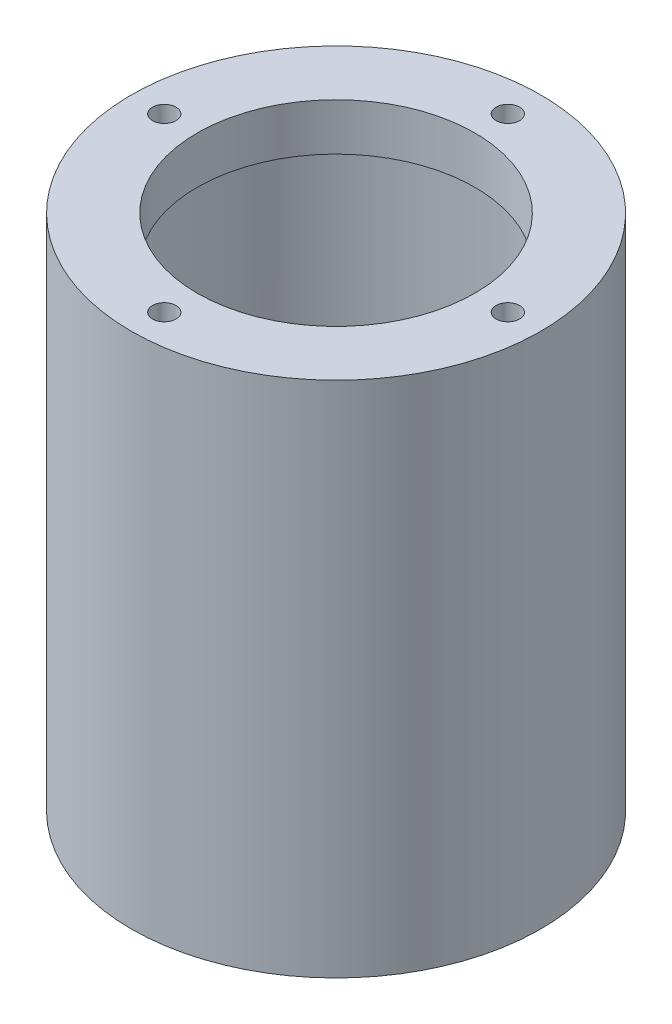
ISO-10303-21;
HEADER;
FILE_DESCRIPTION(('STEP AP214'),'2;1');
FILE_NAME('part.step','',(''),(''),'','','');
FILE_SCHEMA(('AUTOMOTIVE_DESIGN { 1 0 10303 214 1 1 1 1 }'));
ENDSEC;
DATA;
#1=APPLICATION_CONTEXT('core data for automotive mechanical design processes');
#2=APPLICATION_PROTOCOL_DEFINITION('international standard','automotive_design',2000,#1);
#3=PRODUCT_CONTEXT('',#1,'mechanical');
#4=PRODUCT('Part','Part','',(#3));
#5=PRODUCT_RELATED_PRODUCT_CATEGORY('part','',(#4));
#6=PRODUCT_DEFINITION_FORMATION('','',#4);
#7=PRODUCT_DEFINITION_CONTEXT('part definition',#1,'design');
#8=PRODUCT_DEFINITION('design','',#6,#7);
#9=PRODUCT_DEFINITION_SHAPE('','',#8);
#10=(LENGTH_UNIT() NAMED_UNIT(*) SI_UNIT(.MILLI.,.METRE.));
#11=(NAMED_UNIT(*) PLANE_ANGLE_UNIT() SI_UNIT($,.RADIAN.));
#12=(NAMED_UNIT(*) SI_UNIT($,.STERADIAN.) SOLID_ANGLE_UNIT());
#13=UNCERTAINTY_MEASURE_WITH_UNIT(LENGTH_MEASURE(1.E-05),#10,'distance_accuracy_value','');
#14=(GEOMETRIC_REPRESENTATION_CONTEXT(3) GLOBAL_UNCERTAINTY_ASSIGNED_CONTEXT((#13)) GLOBAL_UNIT_ASSIGNED_CONTEXT((#10,
#11,#12)) REPRESENTATION_CONTEXT('',''));
#15=CARTESIAN_POINT('',(0.,0.,0.));
#16=DIRECTION('',(0.,0.,1.));
#17=DIRECTION('',(1.,0.,0.));
#18=AXIS2_PLACEMENT_3D('',#15,#16,#17);
#19=CARTESIAN_POINT('',(0.,55.,0.));
#20=DIRECTION('',(0.,1.,0.));
#21=DIRECTION('',(0.,0.,1.));
#22=AXIS2_PLACEMENT_3D('',#19,#20,#21);
#23=PLANE('',#22);
#24=CARTESIAN_POINT('',(-18.25,55.,0.));
#25=DIRECTION('',(0.,1.,0.));
#26=DIRECTION('',(0.,0.,1.));
#27=AXIS2_PLACEMENT_3D('',#24,#25,#26);
#28=CIRCLE('',#27,1.25);
#29=CARTESIAN_POINT('',(-18.25,55.,1.25));
#30=VERTEX_POINT('',#29);
#31=EDGE_CURVE('E82',#30,#30,#28,.T.);
#32=ORIENTED_EDGE('',*,*,#31,.F.);
#33=EDGE_LOOP('',(#32));
#34=FACE_BOUND('',#33,.T.);
#35=CARTESIAN_POINT('',(0.,55.,18.25));
#36=DIRECTION('',(0.,1.,0.));
#37=DIRECTION('',(0.,0.,1.));
#38=AXIS2_PLACEMENT_3D('',#35,#36,#37);
#39=CIRCLE('',#38,1.25);
#40=CARTESIAN_POINT('',(0.,55.,19.5));
#41=VERTEX_POINT('',#40);
#42=EDGE_CURVE('E81',#41,#41,#39,.T.);
#43=ORIENTED_EDGE('',*,*,#42,.F.);
#44=EDGE_LOOP('',(#43));
#45=FACE_BOUND('',#44,.T.);
#46=CARTESIAN_POINT('',(18.25,55.,0.));
#47=DIRECTION('',(0.,1.,0.));
#48=DIRECTION('',(0.,0.,1.));
#49=AXIS2_PLACEMENT_3D('',#46,#47,#48);
#50=CIRCLE('',#49,1.25);
#51=CARTESIAN_POINT('',(18.25,55.,1.25));
#52=VERTEX_POINT('',#51);
#53=EDGE_CURVE('E267',#52,#52,#50,.T.);
#54=ORIENTED_EDGE('',*,*,#53,.F.);
#55=EDGE_LOOP('',(#54));
#56=FACE_BOUND('',#55,.T.);
#57=CARTESIAN_POINT('',(0.,55.,-18.25));
#58=DIRECTION('',(0.,1.,0.));
#59=DIRECTION('',(0.,0.,1.));
#60=AXIS2_PLACEMENT_3D('',#57,#58,#59);
#61=CIRCLE('',#60,1.25);
#62=CARTESIAN_POINT('',(0.,55.,-17.));
#63=VERTEX_POINT('',#62);
#64=EDGE_CURVE('E112',#63,#63,#61,.T.);
#65=ORIENTED_EDGE('',*,*,#64,.F.);
#66=EDGE_LOOP('',(#65));
#67=FACE_BOUND('',#66,.T.);
#68=CARTESIAN_POINT('',(0.,55.,0.));
#69=DIRECTION('',(0.,1.,0.));
#70=DIRECTION('',(0.,0.,1.));
#71=AXIS2_PLACEMENT_3D('',#68,#69,#70);
#72=CIRCLE('',#71,21.75);
#73=CARTESIAN_POINT('',(0.,55.,21.75));
#74=VERTEX_POINT('',#73);
#75=EDGE_CURVE('E129',#74,#74,#72,.T.);
#76=ORIENTED_EDGE('',*,*,#75,.T.);
#77=EDGE_LOOP('',(#76));
#78=FACE_BOUND('',#77,.T.);
#79=CARTESIAN_POINT('',(0.,55.,0.));
#80=DIRECTION('',(0.,1.,0.));
#81=DIRECTION('',(0.,0.,1.));
#82=AXIS2_PLACEMENT_3D('',#79,#80,#81);
#83=CIRCLE('',#82,14.75);
#84=CARTESIAN_POINT('',(0.,55.,14.75));
#85=VERTEX_POINT('',#84);
#86=EDGE_CURVE('E117',#85,#85,#83,.T.);
#87=ORIENTED_EDGE('',*,*,#86,.F.);
#88=EDGE_LOOP('',(#87));
#89=FACE_BOUND('',#88,.T.);
#90=ADVANCED_FACE('F33',(#34,#45,#56,#67,#78,#89),#23,.T.);
#91=CARTESIAN_POINT('',(0.,0.,0.));
#92=DIRECTION('',(0.,1.,0.));
#93=DIRECTION('',(0.,0.,1.));
#94=AXIS2_PLACEMENT_3D('',#91,#92,#93);
#95=PLANE('',#94);
#96=CARTESIAN_POINT('',(0.,0.,0.));
#97=DIRECTION('',(0.,1.,0.));
#98=DIRECTION('',(0.,0.,1.));
#99=AXIS2_PLACEMENT_3D('',#96,#97,#98);
#100=CIRCLE('',#99,18.75);
#101=CARTESIAN_POINT('',(0.,0.,18.75));
#102=VERTEX_POINT('',#101);
#103=EDGE_CURVE('E115',#102,#102,#100,.T.);
#104=ORIENTED_EDGE('',*,*,#103,.T.);
#105=EDGE_LOOP('',(#104));
#106=FACE_BOUND('',#105,.T.);
#107=CARTESIAN_POINT('',(0.,0.,0.));
#108=DIRECTION('',(0.,1.,0.));
#109=DIRECTION('',(0.,0.,1.));
#110=AXIS2_PLACEMENT_3D('',#107,#108,#109);
#111=CIRCLE('',#110,21.75);
#112=CARTESIAN_POINT('',(0.,0.,21.75));
#113=VERTEX_POINT('',#112);
#114=EDGE_CURVE('E121',#113,#113,#111,.T.);
#115=ORIENTED_EDGE('',*,*,#114,.F.);
#116=EDGE_LOOP('',(#115));
#117=FACE_BOUND('',#116,.T.);
#118=ADVANCED_FACE('F138',(#106,#117),#95,.F.);
#119=CARTESIAN_POINT('',(0.,55.,0.));
#120=DIRECTION('',(0.,-1.,0.));
#121=DIRECTION('',(0.,0.,-1.));
#122=AXIS2_PLACEMENT_3D('',#119,#120,#121);
#123=CYLINDRICAL_SURFACE('',#122,21.75);
#124=ORIENTED_EDGE('',*,*,#75,.F.);
#125=EDGE_LOOP('',(#124));
#126=FACE_BOUND('',#125,.T.);
#127=ORIENTED_EDGE('',*,*,#114,.T.);
#128=EDGE_LOOP('',(#127));
#129=FACE_BOUND('',#128,.T.);
#130=ADVANCED_FACE('F35',(#126,#129),#123,.T.);
#131=CARTESIAN_POINT('',(0.,55.,0.));
#132=DIRECTION('',(0.,-1.,0.));
#133=DIRECTION('',(0.,0.,-1.));
#134=AXIS2_PLACEMENT_3D('',#131,#132,#133);
#135=CYLINDRICAL_SURFACE('',#134,14.75);
#136=CARTESIAN_POINT('',(0.,50.,0.));
#137=DIRECTION('',(0.,1.,0.));
#138=DIRECTION('',(0.,0.,1.));
#139=AXIS2_PLACEMENT_3D('',#136,#137,#138);
#140=CIRCLE('',#139,14.75);
#141=CARTESIAN_POINT('',(0.,50.,14.75));
#142=VERTEX_POINT('',#141);
#143=EDGE_CURVE('E103',#142,#142,#140,.T.);
#144=ORIENTED_EDGE('',*,*,#143,.F.);
#145=EDGE_LOOP('',(#144));
#146=FACE_BOUND('',#145,.T.);
#147=ORIENTED_EDGE('',*,*,#86,.T.);
#148=EDGE_LOOP('',(#147));
#149=FACE_BOUND('',#148,.T.);
#150=ADVANCED_FACE('F144',(#146,#149),#135,.F.);
#151=CARTESIAN_POINT('',(0.,0.,0.));
#152=DIRECTION('',(0.,1.,0.));
#153=DIRECTION('',(0.,0.,1.));
#154=AXIS2_PLACEMENT_3D('',#151,#152,#153);
#155=CYLINDRICAL_SURFACE('',#154,18.75);
#156=ORIENTED_EDGE('',*,*,#103,.F.);
#157=EDGE_LOOP('',(#156));
#158=FACE_BOUND('',#157,.T.);
#159=CARTESIAN_POINT('',(0.,50.,0.));
#160=DIRECTION('',(0.,1.,0.));
#161=DIRECTION('',(0.,0.,1.));
#162=AXIS2_PLACEMENT_3D('',#159,#160,#161);
#163=CIRCLE('',#162,18.75);
#164=CARTESIAN_POINT('',(1.16067474398506,50.,-18.7140410958904));
#165=VERTEX_POINT('',#164);
#166=CARTESIAN_POINT('',(-1.16067474398508,50.,-18.7140410958904));
#167=VERTEX_POINT('',#166);
#168=EDGE_CURVE('E91',#165,#167,#163,.T.);
#169=ORIENTED_EDGE('',*,*,#168,.T.);
#170=CARTESIAN_POINT('',(-18.7140410958904,50.,-1.16067474398506));
#171=VERTEX_POINT('',#170);
#172=EDGE_CURVE('E94',#167,#171,#163,.T.);
#173=ORIENTED_EDGE('',*,*,#172,.T.);
#174=CARTESIAN_POINT('',(-18.7140410958904,50.,1.16067474398508));
#175=VERTEX_POINT('',#174);
#176=EDGE_CURVE('E80',#171,#175,#163,.T.);
#177=ORIENTED_EDGE('',*,*,#176,.T.);
#178=CARTESIAN_POINT('',(-1.16067474398506,50.,18.7140410958904));
#179=VERTEX_POINT('',#178);
#180=EDGE_CURVE('E55',#175,#179,#163,.T.);
#181=ORIENTED_EDGE('',*,*,#180,.T.);
#182=CARTESIAN_POINT('',(1.16067474398508,50.,18.7140410958904));
#183=VERTEX_POINT('',#182);
#184=EDGE_CURVE('E89',#179,#183,#163,.T.);
#185=ORIENTED_EDGE('',*,*,#184,.T.);
#186=CARTESIAN_POINT('',(18.7140410958904,50.,1.16067474398506));
#187=VERTEX_POINT('',#186);
#188=EDGE_CURVE('E95',#183,#187,#163,.T.);
#189=ORIENTED_EDGE('',*,*,#188,.T.);
#190=CARTESIAN_POINT('',(18.7140410958904,50.,-1.16067474398508));
#191=VERTEX_POINT('',#190);
#192=EDGE_CURVE('E96',#187,#191,#163,.T.);
#193=ORIENTED_EDGE('',*,*,#192,.T.);
#194=EDGE_CURVE('E101',#191,#165,#163,.T.);
#195=ORIENTED_EDGE('',*,*,#194,.T.);
#196=EDGE_LOOP('',(#169,#173,#177,#181,#185,#189,#193,#195));
#197=FACE_BOUND('',#196,.T.);
#198=ADVANCED_FACE('F93',(#158,#197),#155,.F.);
#199=CARTESIAN_POINT('',(0.,50.,0.));
#200=DIRECTION('',(0.,1.,0.));
#201=DIRECTION('',(0.,0.,1.));
#202=AXIS2_PLACEMENT_3D('',#199,#200,#201);
#203=PLANE('',#202);
#204=ORIENTED_EDGE('',*,*,#143,.T.);
#205=EDGE_LOOP('',(#204));
#206=FACE_BOUND('',#205,.T.);
#207=ORIENTED_EDGE('',*,*,#180,.F.);
#208=CARTESIAN_POINT('',(-18.25,50.,0.));
#209=DIRECTION('',(0.,1.,0.));
#210=DIRECTION('',(0.,0.,1.));
#211=AXIS2_PLACEMENT_3D('',#208,#209,#210);
#212=CIRCLE('',#211,1.25);
#213=EDGE_CURVE('E11',#175,#171,#212,.T.);
#214=ORIENTED_EDGE('',*,*,#213,.T.);
#215=ORIENTED_EDGE('',*,*,#172,.F.);
#216=CARTESIAN_POINT('',(0.,50.,-18.25));
#217=DIRECTION('',(0.,1.,0.));
#218=DIRECTION('',(0.,0.,1.));
#219=AXIS2_PLACEMENT_3D('',#216,#217,#218);
#220=CIRCLE('',#219,1.25);
#221=EDGE_CURVE('E126',#167,#165,#220,.T.);
#222=ORIENTED_EDGE('',*,*,#221,.T.);
#223=ORIENTED_EDGE('',*,*,#194,.F.);
#224=CARTESIAN_POINT('',(18.25,50.,0.));
#225=DIRECTION('',(0.,1.,0.));
#226=DIRECTION('',(0.,0.,1.));
#227=AXIS2_PLACEMENT_3D('',#224,#225,#226);
#228=CIRCLE('',#227,1.25);
#229=EDGE_CURVE('E41',#191,#187,#228,.T.);
#230=ORIENTED_EDGE('',*,*,#229,.T.);
#231=ORIENTED_EDGE('',*,*,#188,.F.);
#232=CARTESIAN_POINT('',(0.,50.,18.25));
#233=DIRECTION('',(0.,1.,0.));
#234=DIRECTION('',(0.,0.,1.));
#235=AXIS2_PLACEMENT_3D('',#232,#233,#234);
#236=CIRCLE('',#235,1.25);
#237=EDGE_CURVE('E88',#183,#179,#236,.T.);
#238=ORIENTED_EDGE('',*,*,#237,.T.);
#239=EDGE_LOOP('',(#207,#214,#215,#222,#223,#230,#231,#238));
#240=FACE_BOUND('',#239,.T.);
#241=ADVANCED_FACE('F85',(#206,#240),#203,.F.);
#242=CARTESIAN_POINT('',(0.,50.,-18.25));
#243=DIRECTION('',(0.,1.,0.));
#244=DIRECTION('',(0.,0.,1.));
#245=AXIS2_PLACEMENT_3D('',#242,#243,#244);
#246=PLANE('',#245);
#247=ORIENTED_EDGE('',*,*,#168,.F.);
#248=CARTESIAN_POINT('',(0.,50.,-18.25));
#249=DIRECTION('',(0.,1.,0.));
#250=DIRECTION('',(0.,0.,1.));
#251=AXIS2_PLACEMENT_3D('',#248,#249,#250);
#252=CIRCLE('',#251,1.25);
#253=EDGE_CURVE('E107',#165,#167,#252,.T.);
#254=ORIENTED_EDGE('',*,*,#253,.T.);
#255=EDGE_LOOP('',(#247,#254));
#256=FACE_BOUND('',#255,.T.);
#257=ADVANCED_FACE('F125',(#256),#246,.T.);
#258=CARTESIAN_POINT('',(0.,50.,-18.25));
#259=DIRECTION('',(0.,1.,0.));
#260=DIRECTION('',(0.,0.,1.));
#261=AXIS2_PLACEMENT_3D('',#258,#259,#260);
#262=CYLINDRICAL_SURFACE('',#261,1.25);
#263=ORIENTED_EDGE('',*,*,#253,.F.);
#264=ORIENTED_EDGE('',*,*,#221,.F.);
#265=EDGE_LOOP('',(#263,#264));
#266=FACE_BOUND('',#265,.T.);
#267=ORIENTED_EDGE('',*,*,#64,.T.);
#268=EDGE_LOOP('',(#267));
#269=FACE_BOUND('',#268,.T.);
#270=ADVANCED_FACE('F157',(#266,#269),#262,.F.);
#271=CARTESIAN_POINT('',(18.25,50.,0.));
#272=DIRECTION('',(0.,1.,0.));
#273=DIRECTION('',(0.,0.,1.));
#274=AXIS2_PLACEMENT_3D('',#271,#272,#273);
#275=PLANE('',#274);
#276=ORIENTED_EDGE('',*,*,#192,.F.);
#277=CARTESIAN_POINT('',(18.25,50.,0.));
#278=DIRECTION('',(0.,1.,0.));
#279=DIRECTION('',(0.,0.,1.));
#280=AXIS2_PLACEMENT_3D('',#277,#278,#279);
#281=CIRCLE('',#280,1.25);
#282=EDGE_CURVE('E270',#187,#191,#281,.T.);
#283=ORIENTED_EDGE('',*,*,#282,.T.);
#284=EDGE_LOOP('',(#276,#283));
#285=FACE_BOUND('',#284,.T.);
#286=ADVANCED_FACE('F160',(#285),#275,.T.);
#287=CARTESIAN_POINT('',(18.25,50.,0.));
#288=DIRECTION('',(0.,1.,0.));
#289=DIRECTION('',(0.,0.,1.));
#290=AXIS2_PLACEMENT_3D('',#287,#288,#289);
#291=CYLINDRICAL_SURFACE('',#290,1.25);
#292=ORIENTED_EDGE('',*,*,#282,.F.);
#293=ORIENTED_EDGE('',*,*,#229,.F.);
#294=EDGE_LOOP('',(#292,#293));
#295=FACE_BOUND('',#294,.T.);
#296=ORIENTED_EDGE('',*,*,#53,.T.);
#297=EDGE_LOOP('',(#296));
#298=FACE_BOUND('',#297,.T.);
#299=ADVANCED_FACE('F163',(#295,#298),#291,.F.);
#300=CARTESIAN_POINT('',(0.,50.,18.25));
#301=DIRECTION('',(0.,1.,0.));
#302=DIRECTION('',(0.,0.,1.));
#303=AXIS2_PLACEMENT_3D('',#300,#301,#302);
#304=PLANE('',#303);
#305=ORIENTED_EDGE('',*,*,#184,.F.);
#306=EDGE_CURVE('E264',#179,#183,#236,.T.);
#307=ORIENTED_EDGE('',*,*,#306,.T.);
#308=EDGE_LOOP('',(#305,#307));
#309=FACE_BOUND('',#308,.T.);
#310=ADVANCED_FACE('F166',(#309),#304,.T.);
#311=CARTESIAN_POINT('',(0.,50.,18.25));
#312=DIRECTION('',(0.,1.,0.));
#313=DIRECTION('',(0.,0.,1.));
#314=AXIS2_PLACEMENT_3D('',#311,#312,#313);
#315=CYLINDRICAL_SURFACE('',#314,1.25);
#316=ORIENTED_EDGE('',*,*,#237,.F.);
#317=ORIENTED_EDGE('',*,*,#306,.F.);
#318=EDGE_LOOP('',(#316,#317));
#319=FACE_BOUND('',#318,.T.);
#320=ORIENTED_EDGE('',*,*,#42,.T.);
#321=EDGE_LOOP('',(#320));
#322=FACE_BOUND('',#321,.T.);
#323=ADVANCED_FACE('F171',(#319,#322),#315,.F.);
#324=CARTESIAN_POINT('',(-18.25,50.,0.));
#325=DIRECTION('',(0.,1.,0.));
#326=DIRECTION('',(0.,0.,1.));
#327=AXIS2_PLACEMENT_3D('',#324,#325,#326);
#328=PLANE('',#327);
#329=ORIENTED_EDGE('',*,*,#176,.F.);
#330=CARTESIAN_POINT('',(-18.25,50.,0.));
#331=DIRECTION('',(0.,1.,0.));
#332=DIRECTION('',(0.,0.,1.));
#333=AXIS2_PLACEMENT_3D('',#330,#331,#332);
#334=CIRCLE('',#333,1.25);
#335=EDGE_CURVE('E47',#171,#175,#334,.T.);
#336=ORIENTED_EDGE('',*,*,#335,.T.);
#337=EDGE_LOOP('',(#329,#336));
#338=FACE_BOUND('',#337,.T.);
#339=ADVANCED_FACE('F79',(#338),#328,.T.);
#340=CARTESIAN_POINT('',(-18.25,50.,0.));
#341=DIRECTION('',(0.,1.,0.));
#342=DIRECTION('',(0.,0.,1.));
#343=AXIS2_PLACEMENT_3D('',#340,#341,#342);
#344=CYLINDRICAL_SURFACE('',#343,1.25);
#345=ORIENTED_EDGE('',*,*,#335,.F.);
#346=ORIENTED_EDGE('',*,*,#213,.F.);
#347=EDGE_LOOP('',(#345,#346));
#348=FACE_BOUND('',#347,.T.);
#349=ORIENTED_EDGE('',*,*,#31,.T.);
#350=EDGE_LOOP('',(#349));
#351=FACE_BOUND('',#350,.T.);
#352=ADVANCED_FACE('F73',(#348,#351),#344,.F.);
#353=CLOSED_SHELL('',(#90,#118,#130,#150,#198,#241,#257,#270,#286,#299,#310,#323,#339,#352));
#354=MANIFOLD_SOLID_BREP('B2',#353);
#355=ADVANCED_BREP_SHAPE_REPRESENTATION('',(#18,#354),#14);
#356=SHAPE_DEFINITION_REPRESENTATION(#9,#355);
ENDSEC;
END-ISO-10303-21;
